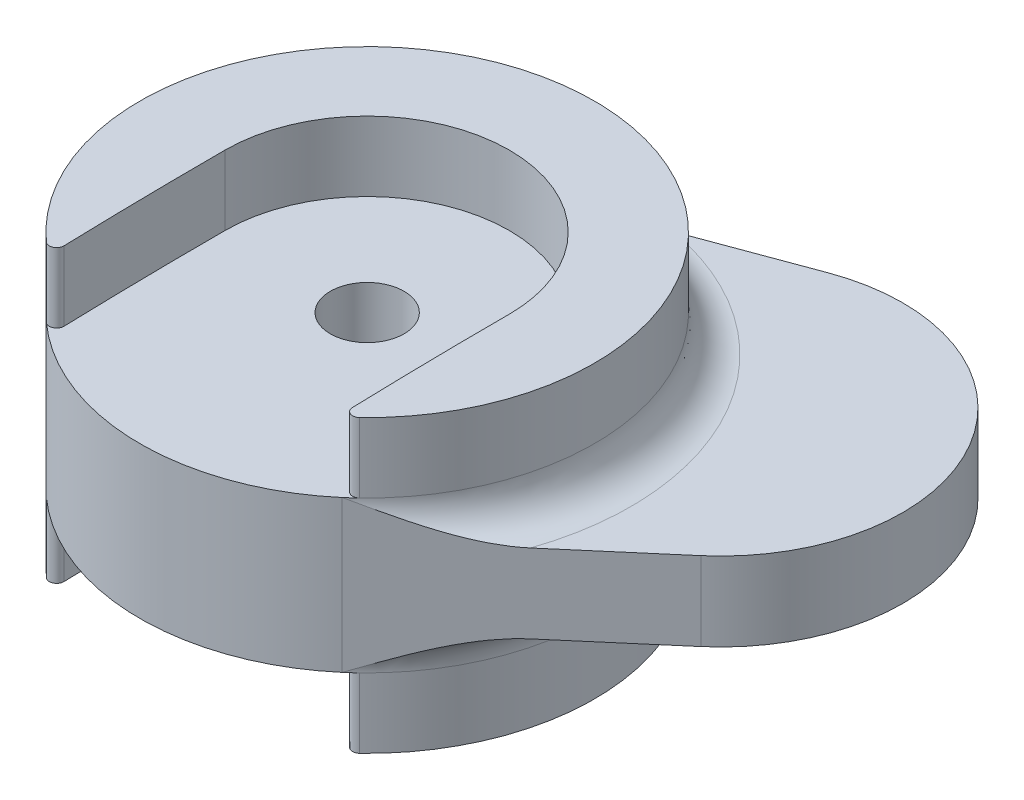
ISO-10303-21;
HEADER;
FILE_DESCRIPTION(('STEP AP214'),'2;1');
FILE_NAME('part.step','',(''),(''),'','','');
FILE_SCHEMA(('AUTOMOTIVE_DESIGN { 1 0 10303 214 1 1 1 1 }'));
ENDSEC;
DATA;
#1=APPLICATION_CONTEXT('core data for automotive mechanical design processes');
#2=APPLICATION_PROTOCOL_DEFINITION('international standard','automotive_design',2000,#1);
#3=PRODUCT_CONTEXT('',#1,'mechanical');
#4=PRODUCT('Part','Part','',(#3));
#5=PRODUCT_RELATED_PRODUCT_CATEGORY('part','',(#4));
#6=PRODUCT_DEFINITION_FORMATION('','',#4);
#7=PRODUCT_DEFINITION_CONTEXT('part definition',#1,'design');
#8=PRODUCT_DEFINITION('design','',#6,#7);
#9=PRODUCT_DEFINITION_SHAPE('','',#8);
#10=(LENGTH_UNIT() NAMED_UNIT(*) SI_UNIT(.MILLI.,.METRE.));
#11=(NAMED_UNIT(*) PLANE_ANGLE_UNIT() SI_UNIT($,.RADIAN.));
#12=(NAMED_UNIT(*) SI_UNIT($,.STERADIAN.) SOLID_ANGLE_UNIT());
#13=UNCERTAINTY_MEASURE_WITH_UNIT(LENGTH_MEASURE(1.E-05),#10,'distance_accuracy_value','');
#14=(GEOMETRIC_REPRESENTATION_CONTEXT(3) GLOBAL_UNCERTAINTY_ASSIGNED_CONTEXT((#13)) GLOBAL_UNIT_ASSIGNED_CONTEXT((#10,
#11,#12)) REPRESENTATION_CONTEXT('',''));
#15=CARTESIAN_POINT('',(0.,0.,0.));
#16=DIRECTION('',(0.,0.,1.));
#17=DIRECTION('',(1.,0.,0.));
#18=AXIS2_PLACEMENT_3D('',#15,#16,#17);
#19=CARTESIAN_POINT('',(-143.787839243062,5.291666582,-388.991549617215));
#20=DIRECTION('',(-0.346713982607537,0.,-0.937970902674716));
#21=DIRECTION('',(-0.937970902674716,0.,0.346713982607537));
#22=AXIS2_PLACEMENT_3D('',#19,#20,#21);
#23=PLANE('',#22);
#24=DIRECTION('',(0.,-1.,0.));
#25=VECTOR('',#24,1.);
#26=CARTESIAN_POINT('',(-213.408848298521,5.291666582,-363.256660342995));
#27=LINE('',#26,#25);
#28=CARTESIAN_POINT('',(-213.408848298521,2.751666582,-363.256660342995));
#29=VERTEX_POINT('',#28);
#30=CARTESIAN_POINT('',(-213.408848298521,-2.751666582,-363.256660342995));
#31=VERTEX_POINT('',#30);
#32=EDGE_CURVE('E182',#29,#31,#27,.T.);
#33=ORIENTED_EDGE('',*,*,#32,.T.);
#34=DIRECTION('',(-0.937970902674715,0.,0.346713982607537));
#35=VECTOR('',#34,1.);
#36=CARTESIAN_POINT('',(-213.408848298521,-2.751666582,-363.256660342995));
#37=LINE('',#36,#35);
#38=CARTESIAN_POINT('',(-221.332305047529,-2.751666582,-360.327813363165));
#39=VERTEX_POINT('',#38);
#40=EDGE_CURVE('E166',#31,#39,#37,.T.);
#41=ORIENTED_EDGE('',*,*,#40,.T.);
#42=CARTESIAN_POINT('',(-221.332305047529,-2.751666582,-360.327813363165));
#43=CARTESIAN_POINT('',(-221.50450530264,-2.75169831798667,-360.264160816924));
#44=CARTESIAN_POINT('',(-221.676647921467,-2.75677687104922,-360.200529575507));
#45=CARTESIAN_POINT('',(-222.020399122895,-2.77592120560781,-360.073464495201));
#46=CARTESIAN_POINT('',(-222.19200796116,-2.78998166913438,-360.010030561807));
#47=CARTESIAN_POINT('',(-222.534012495227,-2.8259371961473,-359.883611124128));
#48=CARTESIAN_POINT('',(-222.704410219598,-2.84781088909311,-359.820624869996));
#49=CARTESIAN_POINT('',(-223.044310945181,-2.89850252619202,-359.694983089508));
#50=CARTESIAN_POINT('',(-223.213813794572,-2.92732161227299,-359.632327619271));
#51=CARTESIAN_POINT('',(-223.717594866881,-3.02236660977883,-359.446108684926));
#52=CARTESIAN_POINT('',(-224.050395835425,-3.0975543705026,-359.323091276933));
#53=CARTESIAN_POINT('',(-224.711913466935,-3.26678042393631,-359.078566194192));
#54=CARTESIAN_POINT('',(-225.040626674402,-3.36083364773652,-358.957059796742));
#55=CARTESIAN_POINT('',(-225.766912019243,-3.58610549452239,-358.68859380947));
#56=CARTESIAN_POINT('',(-226.163490083957,-3.7209346419644,-358.542001671228));
#57=CARTESIAN_POINT('',(-226.95179712503,-4.00592514358841,-358.250609824265));
#58=CARTESIAN_POINT('',(-227.343524816045,-4.1560904683045,-358.105810590661));
#59=CARTESIAN_POINT('',(-228.515040339652,-4.62180959425175,-357.672768572281));
#60=CARTESIAN_POINT('',(-229.289609357759,-4.95205687329837,-357.386454883545));
#61=CARTESIAN_POINT('',(-230.07134056343,-5.2854274308928,-357.097493745332));
#62=CARTESIAN_POINT('',(-230.078655759716,-5.28854701452567,-357.094789737318));
#63=CARTESIAN_POINT('',(-230.085970948077,-5.291666582,-357.092085732233));
#64=B_SPLINE_CURVE_WITH_KNOTS('',3,(#42,#43,#44,#45,#46,#47,#48,#49,#50,#51,#52,#53,#54,#55,#56,
#57,#58,#59,#60,#61,#62,#63),.UNSPECIFIED.,.F.,.F.,(4,2,2,2,2,2,2,2,2,2,4),(0.,
0.550606681228705,1.10088766348238,1.64967491397242,2.19855245503268,3.28587547537377,
4.3740624785398,5.70495765483361,7.03619827741758,9.7038822708696,9.72908147720628),.UNSPECIFIED.);
#65=CARTESIAN_POINT('',(-230.085970948077,-5.291666582,-357.092085732233));
#66=VERTEX_POINT('',#65);
#67=EDGE_CURVE('E265',#39,#66,#64,.T.);
#68=ORIENTED_EDGE('',*,*,#67,.T.);
#69=DIRECTION('',(0.,-1.,0.));
#70=VECTOR('',#69,1.);
#71=CARTESIAN_POINT('',(-230.085970948077,5.291666582,-357.092085732233));
#72=LINE('',#71,#70);
#73=CARTESIAN_POINT('',(-230.085970948077,5.291666582,-357.092085732233));
#74=VERTEX_POINT('',#73);
#75=EDGE_CURVE('E200',#74,#66,#72,.T.);
#76=ORIENTED_EDGE('',*,*,#75,.F.);
#77=CARTESIAN_POINT('',(-221.332305047529,2.751666582,-360.327813363165));
#78=CARTESIAN_POINT('',(-221.50450530264,2.75169831798667,-360.264160816924));
#79=CARTESIAN_POINT('',(-221.676647921467,2.75677687104922,-360.200529575507));
#80=CARTESIAN_POINT('',(-222.020399122895,2.77592120560781,-360.073464495201));
#81=CARTESIAN_POINT('',(-222.19200796116,2.78998166913438,-360.010030561807));
#82=CARTESIAN_POINT('',(-222.534012495227,2.8259371961473,-359.883611124128));
#83=CARTESIAN_POINT('',(-222.704410219598,2.84781088909311,-359.820624869996));
#84=CARTESIAN_POINT('',(-223.044310945181,2.89850252619202,-359.694983089508));
#85=CARTESIAN_POINT('',(-223.213813794572,2.92732161227299,-359.632327619271));
#86=CARTESIAN_POINT('',(-223.717594866881,3.02236660977883,-359.446108684926));
#87=CARTESIAN_POINT('',(-224.050395835425,3.0975543705026,-359.323091276933));
#88=CARTESIAN_POINT('',(-224.711913466935,3.26678042393631,-359.078566194192));
#89=CARTESIAN_POINT('',(-225.040626674402,3.36083364773652,-358.957059796742));
#90=CARTESIAN_POINT('',(-225.766912019243,3.58610549452239,-358.68859380947));
#91=CARTESIAN_POINT('',(-226.163490083957,3.7209346419644,-358.542001671228));
#92=CARTESIAN_POINT('',(-226.95179712503,4.00592514358841,-358.250609824265));
#93=CARTESIAN_POINT('',(-227.343524816045,4.1560904683045,-358.105810590661));
#94=CARTESIAN_POINT('',(-228.515040339652,4.62180959425175,-357.672768572281));
#95=CARTESIAN_POINT('',(-229.289609357759,4.95205687329837,-357.386454883545));
#96=CARTESIAN_POINT('',(-230.07134056343,5.2854274308928,-357.097493745332));
#97=CARTESIAN_POINT('',(-230.078655759716,5.28854701452567,-357.094789737318));
#98=CARTESIAN_POINT('',(-230.085970948077,5.291666582,-357.092085732233));
#99=B_SPLINE_CURVE_WITH_KNOTS('',3,(#77,#78,#79,#80,#81,#82,#83,#84,#85,#86,#87,#88,#89,#90,#91,
#92,#93,#94,#95,#96,#97,#98),.UNSPECIFIED.,.F.,.F.,(4,2,2,2,2,2,2,2,2,2,4),(0.,
0.550606681228705,1.10088766348238,1.64967491397242,2.19855245503268,3.28587547537377,
4.3740624785398,5.70495765483361,7.03619827741758,9.7038822708696,9.72908147720628),.UNSPECIFIED.);
#100=CARTESIAN_POINT('',(-221.332305047529,2.751666582,-360.327813363165));
#101=VERTEX_POINT('',#100);
#102=EDGE_CURVE('E11',#74,#101,#99,.F.);
#103=ORIENTED_EDGE('',*,*,#102,.T.);
#104=DIRECTION('',(-0.937970902674715,0.,0.346713982607537));
#105=VECTOR('',#104,1.);
#106=CARTESIAN_POINT('',(-213.408848298521,2.751666582,-363.256660342995));
#107=LINE('',#106,#105);
#108=EDGE_CURVE('E187',#29,#101,#107,.T.);
#109=ORIENTED_EDGE('',*,*,#108,.F.);
#110=EDGE_LOOP('',(#33,#41,#68,#76,#103,#109));
#111=FACE_BOUND('',#110,.T.);
#112=ADVANCED_FACE('F35',(#111),#23,.T.);
#113=CARTESIAN_POINT('',(-253.57354128557,5.291666582,-296.521080062624));
#114=DIRECTION('',(0.64992307237088,0.,0.759999999999997));
#115=DIRECTION('',(0.759999999999997,0.,-0.64992307237088));
#116=AXIS2_PLACEMENT_3D('',#113,#114,#115);
#117=PLANE('',#116);
#118=DIRECTION('',(0.,-1.,0.));
#119=VECTOR('',#118,1.);
#120=CARTESIAN_POINT('',(-214.264357700295,5.291666582,-330.136797652272));
#121=LINE('',#120,#119);
#122=CARTESIAN_POINT('',(-214.264357700295,5.291666582,-330.136797652272));
#123=VERTEX_POINT('',#122);
#124=CARTESIAN_POINT('',(-214.264357700295,-5.291666582,-330.136797652272));
#125=VERTEX_POINT('',#124);
#126=EDGE_CURVE('E190',#123,#125,#121,.T.);
#127=ORIENTED_EDGE('',*,*,#126,.T.);
#128=CARTESIAN_POINT('',(-207.171615201092,-2.751666582,-336.202241068874));
#129=CARTESIAN_POINT('',(-207.311142124063,-2.75169831798667,-336.082922955116));
#130=CARTESIAN_POINT('',(-207.450622346677,-2.7567768710494,-335.963644777726));
#131=CARTESIAN_POINT('',(-207.729150083887,-2.77592120560865,-335.725458458374));
#132=CARTESIAN_POINT('',(-207.868197805636,-2.78998166913569,-335.606550139262));
#133=CARTESIAN_POINT('',(-208.145310288713,-2.82593719614974,-335.369574091375));
#134=CARTESIAN_POINT('',(-208.28337669371,-2.84781088909618,-335.251504956998));
#135=CARTESIAN_POINT('',(-208.558784545606,-2.89850252619647,-335.015986644815));
#136=CARTESIAN_POINT('',(-208.696125869491,-2.9273216122782,-334.898537572205));
#137=CARTESIAN_POINT('',(-209.104319358074,-3.02236660978467,-334.549466037703));
#138=CARTESIAN_POINT('',(-209.373974563121,-3.09755437050785,-334.318867170144));
#139=CARTESIAN_POINT('',(-209.9099756251,-3.26678042393891,-333.860499463571));
#140=CARTESIAN_POINT('',(-210.176318682181,-3.36083364773708,-333.632733018883));
#141=CARTESIAN_POINT('',(-210.764798410604,-3.58610549452349,-333.129487554246));
#142=CARTESIAN_POINT('',(-211.086129624954,-3.72093464196911,-332.854697330458));
#143=CARTESIAN_POINT('',(-211.724863032897,-4.00592514358236,-332.308476831884));
#144=CARTESIAN_POINT('',(-212.042264185028,-4.15609046828402,-332.037047447717));
#145=CARTESIAN_POINT('',(-212.991495973974,-4.62180959428816,-331.225300552106));
#146=CARTESIAN_POINT('',(-213.619098015824,-4.9520568735051,-330.688599174125));
#147=CARTESIAN_POINT('',(-214.252503289565,-5.28542743089668,-330.146935093118));
#148=CARTESIAN_POINT('',(-214.25843049814,-5.28854701452763,-330.141866369949));
#149=CARTESIAN_POINT('',(-214.264357700295,-5.291666582,-330.136797652272));
#150=B_SPLINE_CURVE_WITH_KNOTS('',3,(#128,#129,#130,#131,#132,#133,#134,#135,#136,#137,#138,
#139,#140,#141,#142,#143,#144,#145,#146,#147,#148,#149),.UNSPECIFIED.,.F.,.F.,(4,2,2,2,2,2,2,2,
2,2,4),(0.,0.550606681238495,1.10088766350189,1.64967491399955,2.19855245506755,
3.28587547539026,4.37406247853989,5.70495765483185,7.03619827741126,9.70388227086949,
9.7290814772063),.UNSPECIFIED.);
#151=CARTESIAN_POINT('',(-207.171615201092,-2.751666582,-336.202241068874));
#152=VERTEX_POINT('',#151);
#153=EDGE_CURVE('E258',#125,#152,#150,.F.);
#154=ORIENTED_EDGE('',*,*,#153,.T.);
#155=DIRECTION('',(0.759999999999997,0.,-0.64992307237088));
#156=VECTOR('',#155,1.);
#157=CARTESIAN_POINT('',(-214.264357700295,-2.751666582,-330.136797652272));
#158=LINE('',#157,#156);
#159=CARTESIAN_POINT('',(-200.751557700295,-2.751666582,-341.692429879027));
#160=VERTEX_POINT('',#159);
#161=EDGE_CURVE('E185',#152,#160,#158,.T.);
#162=ORIENTED_EDGE('',*,*,#161,.T.);
#163=DIRECTION('',(0.,-1.,0.));
#164=VECTOR('',#163,1.);
#165=CARTESIAN_POINT('',(-200.751557700295,5.291666582,-341.692429879027));
#166=LINE('',#165,#164);
#167=CARTESIAN_POINT('',(-200.751557700295,2.751666582,-341.692429879027));
#168=VERTEX_POINT('',#167);
#169=EDGE_CURVE('E184',#168,#160,#166,.T.);
#170=ORIENTED_EDGE('',*,*,#169,.F.);
#171=DIRECTION('',(0.759999999999997,0.,-0.64992307237088));
#172=VECTOR('',#171,1.);
#173=CARTESIAN_POINT('',(-214.264357700295,2.751666582,-330.136797652272));
#174=LINE('',#173,#172);
#175=CARTESIAN_POINT('',(-207.171615201092,2.751666582,-336.202241068874));
#176=VERTEX_POINT('',#175);
#177=EDGE_CURVE('E326',#176,#168,#174,.T.);
#178=ORIENTED_EDGE('',*,*,#177,.F.);
#179=CARTESIAN_POINT('',(-207.171615201092,2.751666582,-336.202241068874));
#180=CARTESIAN_POINT('',(-207.311142124063,2.75169831798667,-336.082922955116));
#181=CARTESIAN_POINT('',(-207.450622346677,2.7567768710494,-335.963644777726));
#182=CARTESIAN_POINT('',(-207.729150083887,2.77592120560865,-335.725458458374));
#183=CARTESIAN_POINT('',(-207.868197805636,2.78998166913569,-335.606550139262));
#184=CARTESIAN_POINT('',(-208.145310288713,2.82593719614974,-335.369574091375));
#185=CARTESIAN_POINT('',(-208.28337669371,2.84781088909618,-335.251504956998));
#186=CARTESIAN_POINT('',(-208.558784545606,2.89850252619647,-335.015986644815));
#187=CARTESIAN_POINT('',(-208.696125869491,2.9273216122782,-334.898537572205));
#188=CARTESIAN_POINT('',(-209.104319358074,3.02236660978467,-334.549466037703));
#189=CARTESIAN_POINT('',(-209.373974563121,3.09755437050785,-334.318867170144));
#190=CARTESIAN_POINT('',(-209.9099756251,3.26678042393891,-333.860499463571));
#191=CARTESIAN_POINT('',(-210.176318682181,3.36083364773708,-333.632733018883));
#192=CARTESIAN_POINT('',(-210.764798410604,3.58610549452349,-333.129487554246));
#193=CARTESIAN_POINT('',(-211.086129624954,3.72093464196911,-332.854697330458));
#194=CARTESIAN_POINT('',(-211.724863032897,4.00592514358236,-332.308476831884));
#195=CARTESIAN_POINT('',(-212.042264185028,4.15609046828402,-332.037047447717));
#196=CARTESIAN_POINT('',(-212.991495973974,4.62180959428816,-331.225300552106));
#197=CARTESIAN_POINT('',(-213.619098015824,4.9520568735051,-330.688599174125));
#198=CARTESIAN_POINT('',(-214.252503289565,5.28542743089668,-330.146935093118));
#199=CARTESIAN_POINT('',(-214.25843049814,5.28854701452763,-330.141866369949));
#200=CARTESIAN_POINT('',(-214.264357700295,5.291666582,-330.136797652272));
#201=B_SPLINE_CURVE_WITH_KNOTS('',3,(#179,#180,#181,#182,#183,#184,#185,#186,#187,#188,#189,
#190,#191,#192,#193,#194,#195,#196,#197,#198,#199,#200),.UNSPECIFIED.,.F.,.F.,(4,2,2,2,2,2,2,2,
2,2,4),(0.,0.550606681238495,1.10088766350189,1.64967491399955,2.19855245506755,
3.28587547539026,4.37406247853989,5.70495765483185,7.03619827741126,9.70388227086949,
9.7290814772063),.UNSPECIFIED.);
#202=EDGE_CURVE('E49',#176,#123,#201,.T.);
#203=ORIENTED_EDGE('',*,*,#202,.T.);
#204=EDGE_LOOP('',(#127,#154,#162,#170,#178,#203));
#205=FACE_BOUND('',#204,.T.);
#206=ADVANCED_FACE('F270',(#205),#117,.T.);
#207=CARTESIAN_POINT('',(-209.005580719405,5.291666582,-351.344429879027));
#208=DIRECTION('',(0.,-1.,0.));
#209=DIRECTION('',(0.,0.,-1.));
#210=AXIS2_PLACEMENT_3D('',#207,#208,#209);
#211=CYLINDRICAL_SURFACE('',#210,12.7);
#212=ORIENTED_EDGE('',*,*,#169,.T.);
#213=CARTESIAN_POINT('',(-209.005580719405,-2.751666582,-351.344429879027));
#214=DIRECTION('',(0.,1.,0.));
#215=DIRECTION('',(0.,0.,1.));
#216=AXIS2_PLACEMENT_3D('',#213,#214,#215);
#217=CIRCLE('',#216,12.7);
#218=EDGE_CURVE('E170',#160,#31,#217,.T.);
#219=ORIENTED_EDGE('',*,*,#218,.T.);
#220=ORIENTED_EDGE('',*,*,#32,.F.);
#221=CARTESIAN_POINT('',(-209.005580719405,2.751666582,-351.344429879027));
#222=DIRECTION('',(0.,1.,0.));
#223=DIRECTION('',(0.,0.,1.));
#224=AXIS2_PLACEMENT_3D('',#221,#222,#223);
#225=CIRCLE('',#224,12.7);
#226=EDGE_CURVE('E328',#168,#29,#225,.T.);
#227=ORIENTED_EDGE('',*,*,#226,.F.);
#228=EDGE_LOOP('',(#212,#219,#220,#227));
#229=FACE_BOUND('',#228,.T.);
#230=ADVANCED_FACE('F180',(#229),#211,.T.);
#231=CARTESIAN_POINT('',(0.,5.291666582,0.));
#232=DIRECTION('',(0.,1.,0.));
#233=DIRECTION('',(0.,0.,1.));
#234=AXIS2_PLACEMENT_3D('',#231,#232,#233);
#235=PLANE('',#234);
#236=CARTESIAN_POINT('',(151.592113525818,5.291666582,-342.201797652272));
#237=DIRECTION('',(0.,1.,0.));
#238=DIRECTION('',(0.,0.,1.));
#239=AXIS2_PLACEMENT_3D('',#236,#237,#238);
#240=CIRCLE('',#239,366.2426);
#241=CARTESIAN_POINT('',(-214.650486474182,5.291666582,-342.201797652272));
#242=VERTEX_POINT('',#241);
#243=CARTESIAN_POINT('',(-214.481229368375,5.291666582,-331.068528723919));
#244=VERTEX_POINT('',#243);
#245=EDGE_CURVE('E368',#242,#244,#240,.T.);
#246=ORIENTED_EDGE('',*,*,#245,.F.);
#247=CARTESIAN_POINT('',(-224.581886474182,5.291666582,-342.201797652272));
#248=DIRECTION('',(0.,1.,0.));
#249=DIRECTION('',(0.,0.,1.));
#250=AXIS2_PLACEMENT_3D('',#247,#248,#249);
#251=CIRCLE('',#250,9.93140000000001);
#252=CARTESIAN_POINT('',(-234.513286474182,5.291666582,-342.201797652272));
#253=VERTEX_POINT('',#252);
#254=EDGE_CURVE('E366',#242,#253,#251,.T.);
#255=ORIENTED_EDGE('',*,*,#254,.T.);
#256=CARTESIAN_POINT('',(151.592113525818,5.291666582,-342.201797652272));
#257=DIRECTION('',(0.,1.,0.));
#258=DIRECTION('',(0.,0.,1.));
#259=AXIS2_PLACEMENT_3D('',#256,#257,#258);
#260=CIRCLE('',#259,386.1054);
#261=CARTESIAN_POINT('',(-234.344486228898,5.291666582,-330.785980601854));
#262=VERTEX_POINT('',#261);
#263=EDGE_CURVE('E359',#253,#262,#260,.T.);
#264=ORIENTED_EDGE('',*,*,#263,.T.);
#265=CARTESIAN_POINT('',(-234.852264137923,5.291666582,-330.770960778091));
#266=DIRECTION('',(0.,1.,0.));
#267=DIRECTION('',(0.,0.,1.));
#268=AXIS2_PLACEMENT_3D('',#265,#266,#267);
#269=CIRCLE('',#268,0.508);
#270=CARTESIAN_POINT('',(-235.191780754906,5.291666582,-330.39308187316));
#271=VERTEX_POINT('',#270);
#272=EDGE_CURVE('E244',#262,#271,#269,.F.);
#273=ORIENTED_EDGE('',*,*,#272,.T.);
#274=CARTESIAN_POINT('',(-224.581886474182,5.291666582,-342.201797652272));
#275=DIRECTION('',(0.,1.,0.));
#276=DIRECTION('',(0.,0.,1.));
#277=AXIS2_PLACEMENT_3D('',#274,#275,#276);
#278=CIRCLE('',#277,15.875);
#279=EDGE_CURVE('E193',#271,#123,#278,.T.);
#280=ORIENTED_EDGE('',*,*,#279,.T.);
#281=CARTESIAN_POINT('',(-213.622772490444,5.291666582,-330.716439769671));
#282=VERTEX_POINT('',#281);
#283=EDGE_CURVE('E372',#123,#282,#278,.T.);
#284=ORIENTED_EDGE('',*,*,#283,.T.);
#285=CARTESIAN_POINT('',(-213.973464137923,5.291666582,-331.083971221913));
#286=DIRECTION('',(0.,1.,0.));
#287=DIRECTION('',(0.,0.,1.));
#288=AXIS2_PLACEMENT_3D('',#285,#286,#287);
#289=CIRCLE('',#288,0.508);
#290=EDGE_CURVE('E247',#282,#244,#289,.F.);
#291=ORIENTED_EDGE('',*,*,#290,.T.);
#292=EDGE_LOOP('',(#246,#255,#264,#273,#280,#284,#291));
#293=FACE_BOUND('',#292,.T.);
#294=CARTESIAN_POINT('',(-224.581886474182,5.291666582,-342.201797652272));
#295=DIRECTION('',(0.,1.,0.));
#296=DIRECTION('',(0.,0.,1.));
#297=AXIS2_PLACEMENT_3D('',#294,#295,#296);
#298=CIRCLE('',#297,2.57810000000001);
#299=CARTESIAN_POINT('',(-224.581886474182,5.291666582,-339.623697652272));
#300=VERTEX_POINT('',#299);
#301=EDGE_CURVE('E188',#300,#300,#298,.T.);
#302=ORIENTED_EDGE('',*,*,#301,.F.);
#303=EDGE_LOOP('',(#302));
#304=FACE_BOUND('',#303,.T.);
#305=ADVANCED_FACE('F312',(#293,#304),#235,.T.);
#306=CARTESIAN_POINT('',(0.,-5.291666582,0.));
#307=DIRECTION('',(0.,1.,0.));
#308=DIRECTION('',(0.,0.,1.));
#309=AXIS2_PLACEMENT_3D('',#306,#307,#308);
#310=PLANE('',#309);
#311=CARTESIAN_POINT('',(-224.581886474182,-5.291666582,-342.201797652272));
#312=DIRECTION('',(0.,1.,0.));
#313=DIRECTION('',(0.,0.,1.));
#314=AXIS2_PLACEMENT_3D('',#311,#312,#313);
#315=CIRCLE('',#314,2.57810000000001);
#316=CARTESIAN_POINT('',(-224.581886474182,-5.291666582,-339.623697652272));
#317=VERTEX_POINT('',#316);
#318=EDGE_CURVE('E196',#317,#317,#315,.T.);
#319=ORIENTED_EDGE('',*,*,#318,.T.);
#320=EDGE_LOOP('',(#319));
#321=FACE_BOUND('',#320,.T.);
#322=CARTESIAN_POINT('',(-224.581886474182,-5.291666582,-342.201797652272));
#323=DIRECTION('',(0.,1.,0.));
#324=DIRECTION('',(0.,0.,1.));
#325=AXIS2_PLACEMENT_3D('',#322,#323,#324);
#326=CIRCLE('',#325,9.93140000000001);
#327=CARTESIAN_POINT('',(-214.650486474182,-5.291666582,-342.201797652272));
#328=VERTEX_POINT('',#327);
#329=CARTESIAN_POINT('',(-234.513286474182,-5.291666582,-342.201797652272));
#330=VERTEX_POINT('',#329);
#331=EDGE_CURVE('E205',#328,#330,#326,.T.);
#332=ORIENTED_EDGE('',*,*,#331,.F.);
#333=CARTESIAN_POINT('',(151.592113525818,-5.291666582,-342.201797652272));
#334=DIRECTION('',(0.,1.,0.));
#335=DIRECTION('',(0.,0.,1.));
#336=AXIS2_PLACEMENT_3D('',#333,#334,#335);
#337=CIRCLE('',#336,366.2426);
#338=CARTESIAN_POINT('',(-214.481229368375,-5.291666582,-331.068528723919));
#339=VERTEX_POINT('',#338);
#340=EDGE_CURVE('E207',#328,#339,#337,.T.);
#341=ORIENTED_EDGE('',*,*,#340,.T.);
#342=CARTESIAN_POINT('',(-213.973464137923,-5.291666582,-331.083971221913));
#343=DIRECTION('',(0.,1.,0.));
#344=DIRECTION('',(0.,0.,1.));
#345=AXIS2_PLACEMENT_3D('',#342,#343,#344);
#346=CIRCLE('',#345,0.508);
#347=CARTESIAN_POINT('',(-213.622772490444,-5.291666582,-330.716439769671));
#348=VERTEX_POINT('',#347);
#349=EDGE_CURVE('E239',#339,#348,#346,.T.);
#350=ORIENTED_EDGE('',*,*,#349,.T.);
#351=CARTESIAN_POINT('',(-224.581886474182,-5.291666582,-342.201797652272));
#352=DIRECTION('',(0.,1.,0.));
#353=DIRECTION('',(0.,0.,1.));
#354=AXIS2_PLACEMENT_3D('',#351,#352,#353);
#355=CIRCLE('',#354,15.875);
#356=EDGE_CURVE('E323',#125,#348,#355,.T.);
#357=ORIENTED_EDGE('',*,*,#356,.F.);
#358=CARTESIAN_POINT('',(-235.191780754906,-5.291666582,-330.39308187316));
#359=VERTEX_POINT('',#358);
#360=EDGE_CURVE('E316',#359,#125,#355,.T.);
#361=ORIENTED_EDGE('',*,*,#360,.F.);
#362=CARTESIAN_POINT('',(-234.852264137923,-5.291666582,-330.770960778091));
#363=DIRECTION('',(0.,1.,0.));
#364=DIRECTION('',(0.,0.,1.));
#365=AXIS2_PLACEMENT_3D('',#362,#363,#364);
#366=CIRCLE('',#365,0.508);
#367=CARTESIAN_POINT('',(-234.344486228898,-5.291666582,-330.785980601854));
#368=VERTEX_POINT('',#367);
#369=EDGE_CURVE('E242',#359,#368,#366,.T.);
#370=ORIENTED_EDGE('',*,*,#369,.T.);
#371=CARTESIAN_POINT('',(151.592113525818,-5.291666582,-342.201797652272));
#372=DIRECTION('',(0.,1.,0.));
#373=DIRECTION('',(0.,0.,1.));
#374=AXIS2_PLACEMENT_3D('',#371,#372,#373);
#375=CIRCLE('',#374,386.1054);
#376=EDGE_CURVE('E202',#330,#368,#375,.T.);
#377=ORIENTED_EDGE('',*,*,#376,.F.);
#378=EDGE_LOOP('',(#332,#341,#350,#357,#361,#370,#377));
#379=FACE_BOUND('',#378,.T.);
#380=ADVANCED_FACE('F303',(#321,#379),#310,.F.);
#381=CARTESIAN_POINT('',(-224.581886474182,5.291666582,-342.201797652272));
#382=DIRECTION('',(0.,-1.,0.));
#383=DIRECTION('',(0.,0.,-1.));
#384=AXIS2_PLACEMENT_3D('',#381,#382,#383);
#385=CYLINDRICAL_SURFACE('',#384,15.875);
#386=ORIENTED_EDGE('',*,*,#360,.T.);
#387=ORIENTED_EDGE('',*,*,#126,.F.);
#388=ORIENTED_EDGE('',*,*,#279,.F.);
#389=DIRECTION('',(0.,-1.,0.));
#390=VECTOR('',#389,1.);
#391=CARTESIAN_POINT('',(-235.191780754906,5.291666582,-330.39308187316));
#392=LINE('',#391,#390);
#393=CARTESIAN_POINT('',(-235.191780754906,10.16,-330.39308187316));
#394=VERTEX_POINT('',#393);
#395=EDGE_CURVE('E216',#271,#394,#392,.F.);
#396=ORIENTED_EDGE('',*,*,#395,.T.);
#397=CARTESIAN_POINT('',(-224.581886474182,10.16,-342.201797652272));
#398=DIRECTION('',(0.,1.,0.));
#399=DIRECTION('',(0.,0.,1.));
#400=AXIS2_PLACEMENT_3D('',#397,#398,#399);
#401=CIRCLE('',#400,15.875);
#402=CARTESIAN_POINT('',(-213.622772490444,10.16,-330.716439769671));
#403=VERTEX_POINT('',#402);
#404=EDGE_CURVE('E336',#403,#394,#401,.T.);
#405=ORIENTED_EDGE('',*,*,#404,.F.);
#406=DIRECTION('',(0.,-1.,0.));
#407=VECTOR('',#406,1.);
#408=CARTESIAN_POINT('',(-213.622772490444,5.291666582,-330.716439769671));
#409=LINE('',#408,#407);
#410=EDGE_CURVE('E213',#403,#282,#409,.T.);
#411=ORIENTED_EDGE('',*,*,#410,.T.);
#412=CARTESIAN_POINT('',(-224.581886474182,5.291666582,-342.201797652272));
#413=DIRECTION('',(0.,1.,0.));
#414=DIRECTION('',(0.,0.,1.));
#415=AXIS2_PLACEMENT_3D('',#412,#413,#414);
#416=CIRCLE('',#415,15.875);
#417=EDGE_CURVE('E249',#282,#74,#416,.T.);
#418=ORIENTED_EDGE('',*,*,#417,.T.);
#419=ORIENTED_EDGE('',*,*,#75,.T.);
#420=CARTESIAN_POINT('',(-224.581886474182,-5.291666582,-342.201797652272));
#421=DIRECTION('',(0.,-1.,0.));
#422=DIRECTION('',(0.,0.,-1.));
#423=AXIS2_PLACEMENT_3D('',#420,#421,#422);
#424=CIRCLE('',#423,15.875);
#425=EDGE_CURVE('E252',#66,#348,#424,.T.);
#426=ORIENTED_EDGE('',*,*,#425,.T.);
#427=DIRECTION('',(0.,-1.,0.));
#428=VECTOR('',#427,1.);
#429=CARTESIAN_POINT('',(-213.622772490444,5.291666582,-330.716439769671));
#430=LINE('',#429,#428);
#431=CARTESIAN_POINT('',(-213.622772490444,-10.16,-330.716439769671));
#432=VERTEX_POINT('',#431);
#433=EDGE_CURVE('E222',#348,#432,#430,.T.);
#434=ORIENTED_EDGE('',*,*,#433,.T.);
#435=CARTESIAN_POINT('',(-224.581886474182,-10.16,-342.201797652272));
#436=DIRECTION('',(0.,1.,0.));
#437=DIRECTION('',(0.,0.,1.));
#438=AXIS2_PLACEMENT_3D('',#435,#436,#437);
#439=CIRCLE('',#438,15.875);
#440=CARTESIAN_POINT('',(-235.191780754906,-10.16,-330.39308187316));
#441=VERTEX_POINT('',#440);
#442=EDGE_CURVE('E348',#432,#441,#439,.T.);
#443=ORIENTED_EDGE('',*,*,#442,.T.);
#444=DIRECTION('',(0.,-1.,0.));
#445=VECTOR('',#444,1.);
#446=CARTESIAN_POINT('',(-235.191780754906,5.291666582,-330.39308187316));
#447=LINE('',#446,#445);
#448=EDGE_CURVE('E219',#441,#359,#447,.F.);
#449=ORIENTED_EDGE('',*,*,#448,.T.);
#450=EDGE_LOOP('',(#386,#387,#388,#396,#405,#411,#418,#419,#426,#434,#443,#449));
#451=FACE_BOUND('',#450,.T.);
#452=ADVANCED_FACE('F299',(#451),#385,.T.);
#453=CARTESIAN_POINT('',(-224.581886474182,5.291666582,-342.201797652272));
#454=DIRECTION('',(0.,-1.,0.));
#455=DIRECTION('',(0.,0.,-1.));
#456=AXIS2_PLACEMENT_3D('',#453,#454,#455);
#457=CYLINDRICAL_SURFACE('',#456,2.57810000000001);
#458=ORIENTED_EDGE('',*,*,#301,.T.);
#459=EDGE_LOOP('',(#458));
#460=FACE_BOUND('',#459,.T.);
#461=ORIENTED_EDGE('',*,*,#318,.F.);
#462=EDGE_LOOP('',(#461));
#463=FACE_BOUND('',#462,.T.);
#464=ADVANCED_FACE('F302',(#460,#463),#457,.F.);
#465=CARTESIAN_POINT('',(0.,-10.16,0.));
#466=DIRECTION('',(0.,1.,0.));
#467=DIRECTION('',(0.,0.,1.));
#468=AXIS2_PLACEMENT_3D('',#465,#466,#467);
#469=PLANE('',#468);
#470=ORIENTED_EDGE('',*,*,#442,.F.);
#471=CARTESIAN_POINT('',(-213.973464137923,-10.16,-331.083971221913));
#472=DIRECTION('',(0.,1.,0.));
#473=DIRECTION('',(0.,0.,1.));
#474=AXIS2_PLACEMENT_3D('',#471,#472,#473);
#475=CIRCLE('',#474,0.508);
#476=CARTESIAN_POINT('',(-214.481229368375,-10.16,-331.068528723919));
#477=VERTEX_POINT('',#476);
#478=EDGE_CURVE('E226',#432,#477,#475,.F.);
#479=ORIENTED_EDGE('',*,*,#478,.T.);
#480=CARTESIAN_POINT('',(151.592113525818,-10.16,-342.201797652272));
#481=DIRECTION('',(0.,1.,0.));
#482=DIRECTION('',(0.,0.,1.));
#483=AXIS2_PLACEMENT_3D('',#480,#481,#482);
#484=CIRCLE('',#483,366.2426);
#485=CARTESIAN_POINT('',(-214.650486474182,-10.16,-342.201797652272));
#486=VERTEX_POINT('',#485);
#487=EDGE_CURVE('E345',#486,#477,#484,.T.);
#488=ORIENTED_EDGE('',*,*,#487,.F.);
#489=CARTESIAN_POINT('',(-224.581886474182,-10.16,-342.201797652272));
#490=DIRECTION('',(0.,1.,0.));
#491=DIRECTION('',(0.,0.,1.));
#492=AXIS2_PLACEMENT_3D('',#489,#490,#491);
#493=CIRCLE('',#492,9.93140000000001);
#494=CARTESIAN_POINT('',(-234.513286474182,-10.16,-342.201797652272));
#495=VERTEX_POINT('',#494);
#496=EDGE_CURVE('E353',#486,#495,#493,.T.);
#497=ORIENTED_EDGE('',*,*,#496,.T.);
#498=CARTESIAN_POINT('',(151.592113525818,-10.16,-342.201797652272));
#499=DIRECTION('',(0.,1.,0.));
#500=DIRECTION('',(0.,0.,1.));
#501=AXIS2_PLACEMENT_3D('',#498,#499,#500);
#502=CIRCLE('',#501,386.1054);
#503=CARTESIAN_POINT('',(-234.344486228898,-10.16,-330.785980601854));
#504=VERTEX_POINT('',#503);
#505=EDGE_CURVE('E350',#495,#504,#502,.T.);
#506=ORIENTED_EDGE('',*,*,#505,.T.);
#507=CARTESIAN_POINT('',(-234.852264137923,-10.16,-330.770960778091));
#508=DIRECTION('',(0.,1.,0.));
#509=DIRECTION('',(0.,0.,1.));
#510=AXIS2_PLACEMENT_3D('',#507,#508,#509);
#511=CIRCLE('',#510,0.508);
#512=EDGE_CURVE('E224',#504,#441,#511,.F.);
#513=ORIENTED_EDGE('',*,*,#512,.T.);
#514=EDGE_LOOP('',(#470,#479,#488,#497,#506,#513));
#515=FACE_BOUND('',#514,.T.);
#516=ADVANCED_FACE('F309',(#515),#469,.F.);
#517=CARTESIAN_POINT('',(151.592113525818,-10.16,-342.201797652272));
#518=DIRECTION('',(0.,1.,0.));
#519=DIRECTION('',(0.,0.,1.));
#520=AXIS2_PLACEMENT_3D('',#517,#518,#519);
#521=CYLINDRICAL_SURFACE('',#520,386.1054);
#522=ORIENTED_EDGE('',*,*,#376,.T.);
#523=DIRECTION('',(0.,1.,0.));
#524=VECTOR('',#523,1.);
#525=CARTESIAN_POINT('',(-234.344486228898,-10.16,-330.785980601854));
#526=LINE('',#525,#524);
#527=EDGE_CURVE('E228',#368,#504,#526,.F.);
#528=ORIENTED_EDGE('',*,*,#527,.T.);
#529=ORIENTED_EDGE('',*,*,#505,.F.);
#530=DIRECTION('',(0.,1.,0.));
#531=VECTOR('',#530,1.);
#532=CARTESIAN_POINT('',(-234.513286474182,-10.16,-342.201797652272));
#533=LINE('',#532,#531);
#534=EDGE_CURVE('E361',#495,#330,#533,.T.);
#535=ORIENTED_EDGE('',*,*,#534,.T.);
#536=EDGE_LOOP('',(#522,#528,#529,#535));
#537=FACE_BOUND('',#536,.T.);
#538=ADVANCED_FACE('F385',(#537),#521,.F.);
#539=CARTESIAN_POINT('',(-224.581886474182,-10.16,-342.201797652272));
#540=DIRECTION('',(0.,1.,0.));
#541=DIRECTION('',(0.,0.,1.));
#542=AXIS2_PLACEMENT_3D('',#539,#540,#541);
#543=CYLINDRICAL_SURFACE('',#542,9.93140000000001);
#544=DIRECTION('',(0.,1.,0.));
#545=VECTOR('',#544,1.);
#546=CARTESIAN_POINT('',(-214.650486474182,-10.16,-342.201797652272));
#547=LINE('',#546,#545);
#548=EDGE_CURVE('E356',#486,#328,#547,.T.);
#549=ORIENTED_EDGE('',*,*,#548,.T.);
#550=ORIENTED_EDGE('',*,*,#331,.T.);
#551=ORIENTED_EDGE('',*,*,#534,.F.);
#552=ORIENTED_EDGE('',*,*,#496,.F.);
#553=EDGE_LOOP('',(#549,#550,#551,#552));
#554=FACE_BOUND('',#553,.T.);
#555=ADVANCED_FACE('F381',(#554),#543,.F.);
#556=CARTESIAN_POINT('',(151.592113525818,-10.16,-342.201797652272));
#557=DIRECTION('',(0.,1.,0.));
#558=DIRECTION('',(0.,0.,1.));
#559=AXIS2_PLACEMENT_3D('',#556,#557,#558);
#560=CYLINDRICAL_SURFACE('',#559,366.2426);
#561=ORIENTED_EDGE('',*,*,#487,.T.);
#562=DIRECTION('',(0.,1.,0.));
#563=VECTOR('',#562,1.);
#564=CARTESIAN_POINT('',(-214.481229368375,-10.16,-331.068528723919));
#565=LINE('',#564,#563);
#566=EDGE_CURVE('E210',#477,#339,#565,.T.);
#567=ORIENTED_EDGE('',*,*,#566,.T.);
#568=ORIENTED_EDGE('',*,*,#340,.F.);
#569=ORIENTED_EDGE('',*,*,#548,.F.);
#570=EDGE_LOOP('',(#561,#567,#568,#569));
#571=FACE_BOUND('',#570,.T.);
#572=ADVANCED_FACE('F394',(#571),#560,.T.);
#573=ORIENTED_EDGE('',*,*,#245,.T.);
#574=DIRECTION('',(0.,1.,0.));
#575=VECTOR('',#574,1.);
#576=CARTESIAN_POINT('',(-214.481229368375,-10.16,-331.068528723919));
#577=LINE('',#576,#575);
#578=CARTESIAN_POINT('',(-214.481229368375,10.16,-331.068528723919));
#579=VERTEX_POINT('',#578);
#580=EDGE_CURVE('E236',#244,#579,#577,.T.);
#581=ORIENTED_EDGE('',*,*,#580,.T.);
#582=CARTESIAN_POINT('',(151.592113525818,10.16,-342.201797652272));
#583=DIRECTION('',(0.,1.,0.));
#584=DIRECTION('',(0.,0.,1.));
#585=AXIS2_PLACEMENT_3D('',#582,#583,#584);
#586=CIRCLE('',#585,366.2426);
#587=CARTESIAN_POINT('',(-214.650486474182,10.16,-342.201797652272));
#588=VERTEX_POINT('',#587);
#589=EDGE_CURVE('E333',#588,#579,#586,.T.);
#590=ORIENTED_EDGE('',*,*,#589,.F.);
#591=EDGE_CURVE('E360',#242,#588,#547,.T.);
#592=ORIENTED_EDGE('',*,*,#591,.F.);
#593=EDGE_LOOP('',(#573,#581,#590,#592));
#594=FACE_BOUND('',#593,.T.);
#595=ADVANCED_FACE('F411',(#594),#560,.T.);
#596=ORIENTED_EDGE('',*,*,#254,.F.);
#597=ORIENTED_EDGE('',*,*,#591,.T.);
#598=CARTESIAN_POINT('',(-224.581886474182,10.16,-342.201797652272));
#599=DIRECTION('',(0.,1.,0.));
#600=DIRECTION('',(0.,0.,1.));
#601=AXIS2_PLACEMENT_3D('',#598,#599,#600);
#602=CIRCLE('',#601,9.93140000000001);
#603=CARTESIAN_POINT('',(-234.513286474182,10.16,-342.201797652272));
#604=VERTEX_POINT('',#603);
#605=EDGE_CURVE('E342',#588,#604,#602,.T.);
#606=ORIENTED_EDGE('',*,*,#605,.T.);
#607=EDGE_CURVE('E355',#253,#604,#533,.T.);
#608=ORIENTED_EDGE('',*,*,#607,.F.);
#609=EDGE_LOOP('',(#596,#597,#606,#608));
#610=FACE_BOUND('',#609,.T.);
#611=ADVANCED_FACE('F415',(#610),#543,.F.);
#612=CARTESIAN_POINT('',(151.592113525818,10.16,-342.201797652272));
#613=DIRECTION('',(0.,1.,0.));
#614=DIRECTION('',(0.,0.,1.));
#615=AXIS2_PLACEMENT_3D('',#612,#613,#614);
#616=CIRCLE('',#615,386.1054);
#617=CARTESIAN_POINT('',(-234.344486228898,10.16,-330.785980601854));
#618=VERTEX_POINT('',#617);
#619=EDGE_CURVE('E339',#604,#618,#616,.T.);
#620=ORIENTED_EDGE('',*,*,#619,.T.);
#621=DIRECTION('',(0.,1.,0.));
#622=VECTOR('',#621,1.);
#623=CARTESIAN_POINT('',(-234.344486228898,-10.16,-330.785980601854));
#624=LINE('',#623,#622);
#625=EDGE_CURVE('E234',#618,#262,#624,.F.);
#626=ORIENTED_EDGE('',*,*,#625,.T.);
#627=ORIENTED_EDGE('',*,*,#263,.F.);
#628=ORIENTED_EDGE('',*,*,#607,.T.);
#629=EDGE_LOOP('',(#620,#626,#627,#628));
#630=FACE_BOUND('',#629,.T.);
#631=ADVANCED_FACE('F420',(#630),#521,.F.);
#632=CARTESIAN_POINT('',(0.,10.16,0.));
#633=DIRECTION('',(0.,1.,0.));
#634=DIRECTION('',(0.,0.,1.));
#635=AXIS2_PLACEMENT_3D('',#632,#633,#634);
#636=PLANE('',#635);
#637=ORIENTED_EDGE('',*,*,#404,.T.);
#638=CARTESIAN_POINT('',(-234.852264137923,10.16,-330.770960778091));
#639=DIRECTION('',(0.,1.,0.));
#640=DIRECTION('',(0.,0.,1.));
#641=AXIS2_PLACEMENT_3D('',#638,#639,#640);
#642=CIRCLE('',#641,0.508);
#643=EDGE_CURVE('E232',#394,#618,#642,.T.);
#644=ORIENTED_EDGE('',*,*,#643,.T.);
#645=ORIENTED_EDGE('',*,*,#619,.F.);
#646=ORIENTED_EDGE('',*,*,#605,.F.);
#647=ORIENTED_EDGE('',*,*,#589,.T.);
#648=CARTESIAN_POINT('',(-213.973464137923,10.16,-331.083971221913));
#649=DIRECTION('',(0.,1.,0.));
#650=DIRECTION('',(0.,0.,1.));
#651=AXIS2_PLACEMENT_3D('',#648,#649,#650);
#652=CIRCLE('',#651,0.508);
#653=EDGE_CURVE('E230',#579,#403,#652,.T.);
#654=ORIENTED_EDGE('',*,*,#653,.T.);
#655=EDGE_LOOP('',(#637,#644,#645,#646,#647,#654));
#656=FACE_BOUND('',#655,.T.);
#657=ADVANCED_FACE('F295',(#656),#636,.T.);
#658=CARTESIAN_POINT('',(-213.973464137923,5.291666582,-331.083971221913));
#659=DIRECTION('',(0.,1.,0.));
#660=DIRECTION('',(0.,0.,1.));
#661=AXIS2_PLACEMENT_3D('',#658,#659,#660);
#662=CYLINDRICAL_SURFACE('',#661,0.508);
#663=ORIENTED_EDGE('',*,*,#478,.F.);
#664=ORIENTED_EDGE('',*,*,#433,.F.);
#665=ORIENTED_EDGE('',*,*,#349,.F.);
#666=ORIENTED_EDGE('',*,*,#566,.F.);
#667=EDGE_LOOP('',(#663,#664,#665,#666));
#668=FACE_BOUND('',#667,.T.);
#669=ADVANCED_FACE('F292',(#668),#662,.T.);
#670=CARTESIAN_POINT('',(-234.852264137923,-10.16,-330.770960778091));
#671=DIRECTION('',(0.,-1.,0.));
#672=DIRECTION('',(0.,0.,-1.));
#673=AXIS2_PLACEMENT_3D('',#670,#671,#672);
#674=CYLINDRICAL_SURFACE('',#673,0.508);
#675=ORIENTED_EDGE('',*,*,#512,.F.);
#676=ORIENTED_EDGE('',*,*,#527,.F.);
#677=ORIENTED_EDGE('',*,*,#369,.F.);
#678=ORIENTED_EDGE('',*,*,#448,.F.);
#679=EDGE_LOOP('',(#675,#676,#677,#678));
#680=FACE_BOUND('',#679,.T.);
#681=ADVANCED_FACE('F288',(#680),#674,.T.);
#682=CARTESIAN_POINT('',(-234.852264137923,-10.16,-330.770960778091));
#683=DIRECTION('',(0.,-1.,0.));
#684=DIRECTION('',(0.,0.,-1.));
#685=AXIS2_PLACEMENT_3D('',#682,#683,#684);
#686=CYLINDRICAL_SURFACE('',#685,0.508);
#687=ORIENTED_EDGE('',*,*,#272,.F.);
#688=ORIENTED_EDGE('',*,*,#625,.F.);
#689=ORIENTED_EDGE('',*,*,#643,.F.);
#690=ORIENTED_EDGE('',*,*,#395,.F.);
#691=EDGE_LOOP('',(#687,#688,#689,#690));
#692=FACE_BOUND('',#691,.T.);
#693=ADVANCED_FACE('F284',(#692),#686,.T.);
#694=CARTESIAN_POINT('',(-213.973464137923,5.291666582,-331.083971221913));
#695=DIRECTION('',(0.,1.,0.));
#696=DIRECTION('',(0.,0.,1.));
#697=AXIS2_PLACEMENT_3D('',#694,#695,#696);
#698=CYLINDRICAL_SURFACE('',#697,0.508);
#699=ORIENTED_EDGE('',*,*,#290,.F.);
#700=ORIENTED_EDGE('',*,*,#410,.F.);
#701=ORIENTED_EDGE('',*,*,#653,.F.);
#702=ORIENTED_EDGE('',*,*,#580,.F.);
#703=EDGE_LOOP('',(#699,#700,#701,#702));
#704=FACE_BOUND('',#703,.T.);
#705=ADVANCED_FACE('F279',(#704),#698,.T.);
#706=CARTESIAN_POINT('',(-224.581886474182,2.751666582,-342.201797652272));
#707=DIRECTION('',(0.,1.,0.));
#708=DIRECTION('',(0.,0.,1.));
#709=AXIS2_PLACEMENT_3D('',#706,#707,#708);
#710=PLANE('',#709);
#711=ORIENTED_EDGE('',*,*,#108,.T.);
#712=CARTESIAN_POINT('',(-224.581886474182,2.751666582,-342.201797652272));
#713=DIRECTION('',(0.,1.,0.));
#714=DIRECTION('',(0.,0.,1.));
#715=AXIS2_PLACEMENT_3D('',#712,#713,#714);
#716=CIRCLE('',#715,18.415);
#717=EDGE_CURVE('E256',#101,#176,#716,.F.);
#718=ORIENTED_EDGE('',*,*,#717,.T.);
#719=ORIENTED_EDGE('',*,*,#177,.T.);
#720=ORIENTED_EDGE('',*,*,#226,.T.);
#721=EDGE_LOOP('',(#711,#718,#719,#720));
#722=FACE_BOUND('',#721,.T.);
#723=ADVANCED_FACE('F283',(#722),#710,.T.);
#724=CARTESIAN_POINT('',(-224.581886474182,-2.751666582,-342.201797652272));
#725=DIRECTION('',(0.,-1.,0.));
#726=DIRECTION('',(0.,0.,1.));
#727=AXIS2_PLACEMENT_3D('',#724,#725,#726);
#728=PLANE('',#727);
#729=ORIENTED_EDGE('',*,*,#161,.F.);
#730=CARTESIAN_POINT('',(-224.581886474182,-2.751666582,-342.201797652272));
#731=DIRECTION('',(0.,-1.,0.));
#732=DIRECTION('',(0.,0.,-1.));
#733=AXIS2_PLACEMENT_3D('',#730,#731,#732);
#734=CIRCLE('',#733,18.415);
#735=EDGE_CURVE('E173',#152,#39,#734,.F.);
#736=ORIENTED_EDGE('',*,*,#735,.T.);
#737=ORIENTED_EDGE('',*,*,#40,.F.);
#738=ORIENTED_EDGE('',*,*,#218,.F.);
#739=EDGE_LOOP('',(#729,#736,#737,#738));
#740=FACE_BOUND('',#739,.T.);
#741=ADVANCED_FACE('F169',(#740),#728,.T.);
#742=CARTESIAN_POINT('',(-224.581886474182,-5.291666582,-342.201797652272));
#743=DIRECTION('',(0.,-1.,0.));
#744=DIRECTION('',(0.,0.,-1.));
#745=AXIS2_PLACEMENT_3D('',#742,#743,#744);
#746=TOROIDAL_SURFACE('',#745,18.415,2.54);
#747=ORIENTED_EDGE('',*,*,#67,.F.);
#748=ORIENTED_EDGE('',*,*,#735,.F.);
#749=ORIENTED_EDGE('',*,*,#153,.F.);
#750=ORIENTED_EDGE('',*,*,#356,.T.);
#751=ORIENTED_EDGE('',*,*,#425,.F.);
#752=EDGE_LOOP('',(#747,#748,#749,#750,#751));
#753=FACE_BOUND('',#752,.T.);
#754=ADVANCED_FACE('F274',(#753),#746,.F.);
#755=CARTESIAN_POINT('',(-224.581886474182,5.291666582,-342.201797652272));
#756=DIRECTION('',(0.,1.,0.));
#757=DIRECTION('',(0.,0.,1.));
#758=AXIS2_PLACEMENT_3D('',#755,#756,#757);
#759=TOROIDAL_SURFACE('',#758,18.415,2.54);
#760=ORIENTED_EDGE('',*,*,#417,.F.);
#761=ORIENTED_EDGE('',*,*,#283,.F.);
#762=ORIENTED_EDGE('',*,*,#202,.F.);
#763=ORIENTED_EDGE('',*,*,#717,.F.);
#764=ORIENTED_EDGE('',*,*,#102,.F.);
#765=EDGE_LOOP('',(#760,#761,#762,#763,#764));
#766=FACE_BOUND('',#765,.T.);
#767=ADVANCED_FACE('F37',(#766),#759,.F.);
#768=CLOSED_SHELL('',(#112,#206,#230,#305,#380,#452,#464,#516,#538,#555,#572,#595,#611,#631,
#657,#669,#681,#693,#705,#723,#741,#754,#767));
#769=MANIFOLD_SOLID_BREP('B2',#768);
#770=ADVANCED_BREP_SHAPE_REPRESENTATION('',(#18,#769),#14);
#771=SHAPE_DEFINITION_REPRESENTATION(#9,#770);
ENDSEC;
END-ISO-10303-21;
